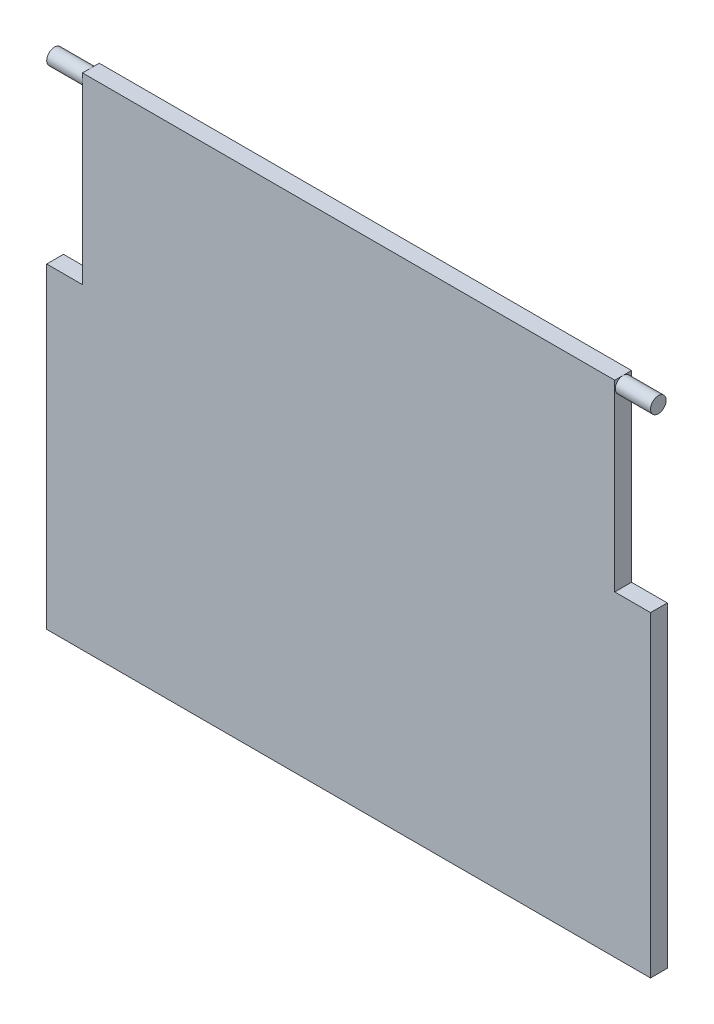
ISO-10303-21;
HEADER;
FILE_DESCRIPTION(('STEP AP214'),'2;1');
FILE_NAME('part.step','',(''),(''),'','','');
FILE_SCHEMA(('AUTOMOTIVE_DESIGN { 1 0 10303 214 1 1 1 1 }'));
ENDSEC;
DATA;
#1=APPLICATION_CONTEXT('core data for automotive mechanical design processes');
#2=APPLICATION_PROTOCOL_DEFINITION('international standard','automotive_design',2000,#1);
#3=PRODUCT_CONTEXT('',#1,'mechanical');
#4=PRODUCT('Part','Part','',(#3));
#5=PRODUCT_RELATED_PRODUCT_CATEGORY('part','',(#4));
#6=PRODUCT_DEFINITION_FORMATION('','',#4);
#7=PRODUCT_DEFINITION_CONTEXT('part definition',#1,'design');
#8=PRODUCT_DEFINITION('design','',#6,#7);
#9=PRODUCT_DEFINITION_SHAPE('','',#8);
#10=(LENGTH_UNIT() NAMED_UNIT(*) SI_UNIT(.MILLI.,.METRE.));
#11=(NAMED_UNIT(*) PLANE_ANGLE_UNIT() SI_UNIT($,.RADIAN.));
#12=(NAMED_UNIT(*) SI_UNIT($,.STERADIAN.) SOLID_ANGLE_UNIT());
#13=UNCERTAINTY_MEASURE_WITH_UNIT(LENGTH_MEASURE(1.E-05),#10,'distance_accuracy_value','');
#14=(GEOMETRIC_REPRESENTATION_CONTEXT(3) GLOBAL_UNCERTAINTY_ASSIGNED_CONTEXT((#13)) GLOBAL_UNIT_ASSIGNED_CONTEXT((#10,
#11,#12)) REPRESENTATION_CONTEXT('',''));
#15=CARTESIAN_POINT('',(0.,0.,0.));
#16=DIRECTION('',(0.,0.,1.));
#17=DIRECTION('',(1.,0.,0.));
#18=AXIS2_PLACEMENT_3D('',#15,#16,#17);
#19=CARTESIAN_POINT('',(50.75,0.,1.5));
#20=DIRECTION('',(1.,0.,0.));
#21=DIRECTION('',(0.,0.,-1.));
#22=AXIS2_PLACEMENT_3D('',#19,#20,#21);
#23=PLANE('',#22);
#24=CARTESIAN_POINT('',(50.75,0.699999999999951,0.75));
#25=DIRECTION('',(1.,0.,0.));
#26=DIRECTION('',(0.,0.,-1.));
#27=AXIS2_PLACEMENT_3D('',#24,#25,#26);
#28=CIRCLE('',#27,0.699999999999999);
#29=CARTESIAN_POINT('',(50.75,0.699999999999951,0.0500000000000013));
#30=VERTEX_POINT('',#29);
#31=EDGE_CURVE('E251',#30,#30,#28,.T.);
#32=ORIENTED_EDGE('',*,*,#31,.T.);
#33=EDGE_LOOP('',(#32));
#34=FACE_BOUND('',#33,.T.);
#35=ADVANCED_FACE('F87',(#34),#23,.T.);
#36=CARTESIAN_POINT('',(0.,1.4,1.5));
#37=DIRECTION('',(0.,1.,0.));
#38=DIRECTION('',(0.,0.,1.));
#39=AXIS2_PLACEMENT_3D('',#36,#37,#38);
#40=PLANE('',#39);
#41=DIRECTION('',(1.,0.,0.));
#42=VECTOR('',#41,1.);
#43=CARTESIAN_POINT('',(0.,1.4,1.5));
#44=LINE('',#43,#42);
#45=CARTESIAN_POINT('',(0.,1.4,1.5));
#46=VERTEX_POINT('',#45);
#47=CARTESIAN_POINT('',(47.6,1.39999999999995,1.5));
#48=VERTEX_POINT('',#47);
#49=EDGE_CURVE('E204',#46,#48,#44,.T.);
#50=ORIENTED_EDGE('',*,*,#49,.T.);
#51=DIRECTION('',(0.,0.,-1.));
#52=VECTOR('',#51,1.);
#53=CARTESIAN_POINT('',(47.6,1.39999999999995,1.5));
#54=LINE('',#53,#52);
#55=CARTESIAN_POINT('',(47.6,1.39999999999995,0.75));
#56=VERTEX_POINT('',#55);
#57=EDGE_CURVE('E223',#48,#56,#54,.T.);
#58=ORIENTED_EDGE('',*,*,#57,.T.);
#59=DIRECTION('',(0.,0.,-1.));
#60=VECTOR('',#59,1.);
#61=CARTESIAN_POINT('',(47.6,1.39999999999995,1.5));
#62=LINE('',#61,#60);
#63=CARTESIAN_POINT('',(47.6,1.39999999999995,0.));
#64=VERTEX_POINT('',#63);
#65=EDGE_CURVE('E247',#56,#64,#62,.T.);
#66=ORIENTED_EDGE('',*,*,#65,.T.);
#67=DIRECTION('',(1.,0.,0.));
#68=VECTOR('',#67,1.);
#69=CARTESIAN_POINT('',(0.,1.4,0.));
#70=LINE('',#69,#68);
#71=CARTESIAN_POINT('',(0.,1.4,0.));
#72=VERTEX_POINT('',#71);
#73=EDGE_CURVE('E186',#72,#64,#70,.T.);
#74=ORIENTED_EDGE('',*,*,#73,.F.);
#75=DIRECTION('',(0.,0.,-1.));
#76=VECTOR('',#75,1.);
#77=CARTESIAN_POINT('',(0.,1.4,0.));
#78=LINE('',#77,#76);
#79=CARTESIAN_POINT('',(0.,1.4,0.75));
#80=VERTEX_POINT('',#79);
#81=EDGE_CURVE('E240',#80,#72,#78,.T.);
#82=ORIENTED_EDGE('',*,*,#81,.F.);
#83=DIRECTION('',(0.,0.,-1.));
#84=VECTOR('',#83,1.);
#85=CARTESIAN_POINT('',(0.,1.4,0.));
#86=LINE('',#85,#84);
#87=EDGE_CURVE('E241',#46,#80,#86,.T.);
#88=ORIENTED_EDGE('',*,*,#87,.F.);
#89=EDGE_LOOP('',(#50,#58,#66,#74,#82,#88));
#90=FACE_BOUND('',#89,.T.);
#91=ADVANCED_FACE('F89',(#90),#40,.T.);
#92=CARTESIAN_POINT('',(0.,0.,1.5));
#93=DIRECTION('',(0.,0.,1.));
#94=DIRECTION('',(1.,0.,0.));
#95=AXIS2_PLACEMENT_3D('',#92,#93,#94);
#96=PLANE('',#95);
#97=DIRECTION('',(0.,-1.,0.));
#98=VECTOR('',#97,1.);
#99=CARTESIAN_POINT('',(47.6,0.,1.5));
#100=LINE('',#99,#98);
#101=CARTESIAN_POINT('',(47.6,-15.,1.5));
#102=VERTEX_POINT('',#101);
#103=EDGE_CURVE('E184',#48,#102,#100,.T.);
#104=ORIENTED_EDGE('',*,*,#103,.F.);
#105=ORIENTED_EDGE('',*,*,#49,.F.);
#106=DIRECTION('',(0.,-1.,0.));
#107=VECTOR('',#106,1.);
#108=CARTESIAN_POINT('',(0.,0.,1.5));
#109=LINE('',#108,#107);
#110=CARTESIAN_POINT('',(0.,-15.,1.5));
#111=VERTEX_POINT('',#110);
#112=EDGE_CURVE('E145',#46,#111,#109,.T.);
#113=ORIENTED_EDGE('',*,*,#112,.T.);
#114=DIRECTION('',(-1.,0.,0.));
#115=VECTOR('',#114,1.);
#116=CARTESIAN_POINT('',(0.,-15.,1.5));
#117=LINE('',#116,#115);
#118=CARTESIAN_POINT('',(-3.19999999999999,-15.,1.5));
#119=VERTEX_POINT('',#118);
#120=EDGE_CURVE('E179',#111,#119,#117,.T.);
#121=ORIENTED_EDGE('',*,*,#120,.T.);
#122=DIRECTION('',(0.,1.,0.));
#123=VECTOR('',#122,1.);
#124=CARTESIAN_POINT('',(-3.19999999999999,0.,1.5));
#125=LINE('',#124,#123);
#126=CARTESIAN_POINT('',(-3.19999999999999,-43.3,1.5));
#127=VERTEX_POINT('',#126);
#128=EDGE_CURVE('E177',#127,#119,#125,.T.);
#129=ORIENTED_EDGE('',*,*,#128,.F.);
#130=DIRECTION('',(-1.,0.,0.));
#131=VECTOR('',#130,1.);
#132=CARTESIAN_POINT('',(0.,-43.3,1.5));
#133=LINE('',#132,#131);
#134=CARTESIAN_POINT('',(50.8,-43.3,1.5));
#135=VERTEX_POINT('',#134);
#136=EDGE_CURVE('E161',#135,#127,#133,.T.);
#137=ORIENTED_EDGE('',*,*,#136,.F.);
#138=DIRECTION('',(0.,1.,0.));
#139=VECTOR('',#138,1.);
#140=CARTESIAN_POINT('',(50.8,0.,1.5));
#141=LINE('',#140,#139);
#142=CARTESIAN_POINT('',(50.8,-15.,1.5));
#143=VERTEX_POINT('',#142);
#144=EDGE_CURVE('E170',#135,#143,#141,.T.);
#145=ORIENTED_EDGE('',*,*,#144,.T.);
#146=DIRECTION('',(-1.,0.,0.));
#147=VECTOR('',#146,1.);
#148=CARTESIAN_POINT('',(0.,-14.9999999999999,1.5));
#149=LINE('',#148,#147);
#150=EDGE_CURVE('E111',#143,#102,#149,.T.);
#151=ORIENTED_EDGE('',*,*,#150,.T.);
#152=EDGE_LOOP('',(#104,#105,#113,#121,#129,#137,#145,#151));
#153=FACE_BOUND('',#152,.T.);
#154=ADVANCED_FACE('F175',(#153),#96,.T.);
#155=CARTESIAN_POINT('',(0.,0.,0.));
#156=DIRECTION('',(0.,0.,1.));
#157=DIRECTION('',(1.,0.,0.));
#158=AXIS2_PLACEMENT_3D('',#155,#156,#157);
#159=PLANE('',#158);
#160=ORIENTED_EDGE('',*,*,#73,.T.);
#161=DIRECTION('',(0.,-1.,0.));
#162=VECTOR('',#161,1.);
#163=CARTESIAN_POINT('',(47.6,0.,0.));
#164=LINE('',#163,#162);
#165=CARTESIAN_POINT('',(47.6,-15.,0.));
#166=VERTEX_POINT('',#165);
#167=EDGE_CURVE('E201',#64,#166,#164,.T.);
#168=ORIENTED_EDGE('',*,*,#167,.T.);
#169=DIRECTION('',(-1.,0.,0.));
#170=VECTOR('',#169,1.);
#171=CARTESIAN_POINT('',(0.,-14.9999999999999,0.));
#172=LINE('',#171,#170);
#173=CARTESIAN_POINT('',(50.8,-15.,0.));
#174=VERTEX_POINT('',#173);
#175=EDGE_CURVE('E199',#174,#166,#172,.T.);
#176=ORIENTED_EDGE('',*,*,#175,.F.);
#177=DIRECTION('',(0.,1.,0.));
#178=VECTOR('',#177,1.);
#179=CARTESIAN_POINT('',(50.8,0.,0.));
#180=LINE('',#179,#178);
#181=CARTESIAN_POINT('',(50.8,-43.3,0.));
#182=VERTEX_POINT('',#181);
#183=EDGE_CURVE('E197',#182,#174,#180,.T.);
#184=ORIENTED_EDGE('',*,*,#183,.F.);
#185=DIRECTION('',(-1.,0.,0.));
#186=VECTOR('',#185,1.);
#187=CARTESIAN_POINT('',(0.,-43.3,0.));
#188=LINE('',#187,#186);
#189=CARTESIAN_POINT('',(-3.19999999999999,-43.3,0.));
#190=VERTEX_POINT('',#189);
#191=EDGE_CURVE('E163',#182,#190,#188,.T.);
#192=ORIENTED_EDGE('',*,*,#191,.T.);
#193=DIRECTION('',(0.,1.,0.));
#194=VECTOR('',#193,1.);
#195=CARTESIAN_POINT('',(-3.19999999999999,0.,0.));
#196=LINE('',#195,#194);
#197=CARTESIAN_POINT('',(-3.19999999999999,-15.,0.));
#198=VERTEX_POINT('',#197);
#199=EDGE_CURVE('E193',#190,#198,#196,.T.);
#200=ORIENTED_EDGE('',*,*,#199,.T.);
#201=DIRECTION('',(-1.,0.,0.));
#202=VECTOR('',#201,1.);
#203=CARTESIAN_POINT('',(0.,-15.,0.));
#204=LINE('',#203,#202);
#205=CARTESIAN_POINT('',(0.,-15.,0.));
#206=VERTEX_POINT('',#205);
#207=EDGE_CURVE('E190',#206,#198,#204,.T.);
#208=ORIENTED_EDGE('',*,*,#207,.F.);
#209=DIRECTION('',(0.,-1.,0.));
#210=VECTOR('',#209,1.);
#211=CARTESIAN_POINT('',(0.,0.,0.));
#212=LINE('',#211,#210);
#213=EDGE_CURVE('E102',#72,#206,#212,.T.);
#214=ORIENTED_EDGE('',*,*,#213,.F.);
#215=EDGE_LOOP('',(#160,#168,#176,#184,#192,#200,#208,#214));
#216=FACE_BOUND('',#215,.T.);
#217=ADVANCED_FACE('F214',(#216),#159,.F.);
#218=CARTESIAN_POINT('',(-3.24999999999999,0.,1.5));
#219=DIRECTION('',(1.,0.,0.));
#220=DIRECTION('',(0.,1.,0.));
#221=AXIS2_PLACEMENT_3D('',#218,#219,#220);
#222=PLANE('',#221);
#223=CARTESIAN_POINT('',(-3.24999999999999,0.699999999999998,0.75));
#224=DIRECTION('',(-1.,0.,0.));
#225=DIRECTION('',(0.,-1.,0.));
#226=AXIS2_PLACEMENT_3D('',#223,#224,#225);
#227=CIRCLE('',#226,0.699999999999999);
#228=CARTESIAN_POINT('',(-3.24999999999999,0.,0.75));
#229=VERTEX_POINT('',#228);
#230=EDGE_CURVE('E188',#229,#229,#227,.T.);
#231=ORIENTED_EDGE('',*,*,#230,.T.);
#232=EDGE_LOOP('',(#231));
#233=FACE_BOUND('',#232,.T.);
#234=ADVANCED_FACE('F296',(#233),#222,.F.);
#235=CARTESIAN_POINT('',(0.,0.,1.5));
#236=DIRECTION('',(1.,0.,0.));
#237=DIRECTION('',(0.,1.,0.));
#238=AXIS2_PLACEMENT_3D('',#235,#236,#237);
#239=PLANE('',#238);
#240=ORIENTED_EDGE('',*,*,#213,.T.);
#241=DIRECTION('',(0.,0.,-1.));
#242=VECTOR('',#241,1.);
#243=CARTESIAN_POINT('',(0.,-15.,1.5));
#244=LINE('',#243,#242);
#245=EDGE_CURVE('E12',#111,#206,#244,.T.);
#246=ORIENTED_EDGE('',*,*,#245,.F.);
#247=ORIENTED_EDGE('',*,*,#112,.F.);
#248=ORIENTED_EDGE('',*,*,#87,.T.);
#249=CARTESIAN_POINT('',(0.,0.699999999999995,0.75));
#250=DIRECTION('',(1.,0.,0.));
#251=DIRECTION('',(0.,1.,0.));
#252=AXIS2_PLACEMENT_3D('',#249,#250,#251);
#253=CIRCLE('',#252,0.699999999999999);
#254=EDGE_CURVE('E237',#80,#80,#253,.F.);
#255=ORIENTED_EDGE('',*,*,#254,.F.);
#256=ORIENTED_EDGE('',*,*,#81,.T.);
#257=EDGE_LOOP('',(#240,#246,#247,#248,#255,#256));
#258=FACE_BOUND('',#257,.T.);
#259=ADVANCED_FACE('F243',(#258),#239,.F.);
#260=CARTESIAN_POINT('',(0.,-15.,1.5));
#261=DIRECTION('',(0.,-1.,0.));
#262=DIRECTION('',(1.,0.,0.));
#263=AXIS2_PLACEMENT_3D('',#260,#261,#262);
#264=PLANE('',#263);
#265=ORIENTED_EDGE('',*,*,#207,.T.);
#266=DIRECTION('',(0.,0.,-1.));
#267=VECTOR('',#266,1.);
#268=CARTESIAN_POINT('',(-3.19999999999999,-15.,1.5));
#269=LINE('',#268,#267);
#270=EDGE_CURVE('E95',#119,#198,#269,.T.);
#271=ORIENTED_EDGE('',*,*,#270,.F.);
#272=ORIENTED_EDGE('',*,*,#120,.F.);
#273=ORIENTED_EDGE('',*,*,#245,.T.);
#274=EDGE_LOOP('',(#265,#271,#272,#273));
#275=FACE_BOUND('',#274,.T.);
#276=ADVANCED_FACE('F213',(#275),#264,.F.);
#277=CARTESIAN_POINT('',(-3.19999999999999,0.,1.5));
#278=DIRECTION('',(-1.,0.,0.));
#279=DIRECTION('',(0.,0.,1.));
#280=AXIS2_PLACEMENT_3D('',#277,#278,#279);
#281=PLANE('',#280);
#282=ORIENTED_EDGE('',*,*,#199,.F.);
#283=DIRECTION('',(0.,0.,-1.));
#284=VECTOR('',#283,1.);
#285=CARTESIAN_POINT('',(-3.19999999999999,-43.3,1.5));
#286=LINE('',#285,#284);
#287=EDGE_CURVE('E166',#127,#190,#286,.T.);
#288=ORIENTED_EDGE('',*,*,#287,.F.);
#289=ORIENTED_EDGE('',*,*,#128,.T.);
#290=ORIENTED_EDGE('',*,*,#270,.T.);
#291=EDGE_LOOP('',(#282,#288,#289,#290));
#292=FACE_BOUND('',#291,.T.);
#293=ADVANCED_FACE('F210',(#292),#281,.T.);
#294=CARTESIAN_POINT('',(0.,-43.3,1.5));
#295=DIRECTION('',(0.,-1.,0.));
#296=DIRECTION('',(0.,0.,-1.));
#297=AXIS2_PLACEMENT_3D('',#294,#295,#296);
#298=PLANE('',#297);
#299=ORIENTED_EDGE('',*,*,#191,.F.);
#300=DIRECTION('',(0.,0.,-1.));
#301=VECTOR('',#300,1.);
#302=CARTESIAN_POINT('',(50.8,-43.3,1.5));
#303=LINE('',#302,#301);
#304=EDGE_CURVE('E157',#135,#182,#303,.T.);
#305=ORIENTED_EDGE('',*,*,#304,.F.);
#306=ORIENTED_EDGE('',*,*,#136,.T.);
#307=ORIENTED_EDGE('',*,*,#287,.T.);
#308=EDGE_LOOP('',(#299,#305,#306,#307));
#309=FACE_BOUND('',#308,.T.);
#310=ADVANCED_FACE('F159',(#309),#298,.T.);
#311=CARTESIAN_POINT('',(50.8,0.,1.5));
#312=DIRECTION('',(-1.,0.,0.));
#313=DIRECTION('',(0.,0.,1.));
#314=AXIS2_PLACEMENT_3D('',#311,#312,#313);
#315=PLANE('',#314);
#316=ORIENTED_EDGE('',*,*,#183,.T.);
#317=DIRECTION('',(0.,0.,-1.));
#318=VECTOR('',#317,1.);
#319=CARTESIAN_POINT('',(50.8,-15.,1.5));
#320=LINE('',#319,#318);
#321=EDGE_CURVE('E167',#143,#174,#320,.T.);
#322=ORIENTED_EDGE('',*,*,#321,.F.);
#323=ORIENTED_EDGE('',*,*,#144,.F.);
#324=ORIENTED_EDGE('',*,*,#304,.T.);
#325=EDGE_LOOP('',(#316,#322,#323,#324));
#326=FACE_BOUND('',#325,.T.);
#327=ADVANCED_FACE('F171',(#326),#315,.F.);
#328=CARTESIAN_POINT('',(0.,-14.9999999999999,1.5));
#329=DIRECTION('',(0.,-1.,0.));
#330=DIRECTION('',(1.,0.,0.));
#331=AXIS2_PLACEMENT_3D('',#328,#329,#330);
#332=PLANE('',#331);
#333=ORIENTED_EDGE('',*,*,#175,.T.);
#334=DIRECTION('',(0.,0.,-1.));
#335=VECTOR('',#334,1.);
#336=CARTESIAN_POINT('',(47.6,-15.,1.5));
#337=LINE('',#336,#335);
#338=EDGE_CURVE('E137',#102,#166,#337,.T.);
#339=ORIENTED_EDGE('',*,*,#338,.F.);
#340=ORIENTED_EDGE('',*,*,#150,.F.);
#341=ORIENTED_EDGE('',*,*,#321,.T.);
#342=EDGE_LOOP('',(#333,#339,#340,#341));
#343=FACE_BOUND('',#342,.T.);
#344=ADVANCED_FACE('F217',(#343),#332,.F.);
#345=CARTESIAN_POINT('',(47.6,0.,1.5));
#346=DIRECTION('',(1.,0.,0.));
#347=DIRECTION('',(0.,0.,-1.));
#348=AXIS2_PLACEMENT_3D('',#345,#346,#347);
#349=PLANE('',#348);
#350=ORIENTED_EDGE('',*,*,#167,.F.);
#351=ORIENTED_EDGE('',*,*,#65,.F.);
#352=CARTESIAN_POINT('',(47.6,0.699999999999951,0.75));
#353=DIRECTION('',(1.,0.,0.));
#354=DIRECTION('',(0.,0.,-1.));
#355=AXIS2_PLACEMENT_3D('',#352,#353,#354);
#356=CIRCLE('',#355,0.699999999999999);
#357=EDGE_CURVE('E245',#56,#56,#356,.F.);
#358=ORIENTED_EDGE('',*,*,#357,.T.);
#359=ORIENTED_EDGE('',*,*,#57,.F.);
#360=ORIENTED_EDGE('',*,*,#103,.T.);
#361=ORIENTED_EDGE('',*,*,#338,.T.);
#362=EDGE_LOOP('',(#350,#351,#358,#359,#360,#361));
#363=FACE_BOUND('',#362,.T.);
#364=ADVANCED_FACE('F219',(#363),#349,.T.);
#365=CARTESIAN_POINT('',(1.58823801742686,0.699999999999994,0.75));
#366=DIRECTION('',(-1.,0.,0.));
#367=DIRECTION('',(0.,-1.,0.));
#368=AXIS2_PLACEMENT_3D('',#365,#366,#367);
#369=CYLINDRICAL_SURFACE('',#368,0.699999999999999);
#370=ORIENTED_EDGE('',*,*,#230,.F.);
#371=EDGE_LOOP('',(#370));
#372=FACE_BOUND('',#371,.T.);
#373=ORIENTED_EDGE('',*,*,#254,.T.);
#374=EDGE_LOOP('',(#373));
#375=FACE_BOUND('',#374,.T.);
#376=ADVANCED_FACE('F238',(#372,#375),#369,.T.);
#377=CARTESIAN_POINT('',(46.0117619825731,0.699999999999951,0.75));
#378=DIRECTION('',(1.,0.,0.));
#379=DIRECTION('',(0.,0.,-1.));
#380=AXIS2_PLACEMENT_3D('',#377,#378,#379);
#381=CYLINDRICAL_SURFACE('',#380,0.699999999999999);
#382=ORIENTED_EDGE('',*,*,#31,.F.);
#383=EDGE_LOOP('',(#382));
#384=FACE_BOUND('',#383,.T.);
#385=ORIENTED_EDGE('',*,*,#357,.F.);
#386=EDGE_LOOP('',(#385));
#387=FACE_BOUND('',#386,.T.);
#388=ADVANCED_FACE('F262',(#384,#387),#381,.T.);
#389=CLOSED_SHELL('',(#35,#91,#154,#217,#234,#259,#276,#293,#310,#327,#344,#364,#376,#388));
#390=MANIFOLD_SOLID_BREP('B2',#389);
#391=ADVANCED_BREP_SHAPE_REPRESENTATION('',(#18,#390),#14);
#392=SHAPE_DEFINITION_REPRESENTATION(#9,#391);
ENDSEC;
END-ISO-10303-21;
